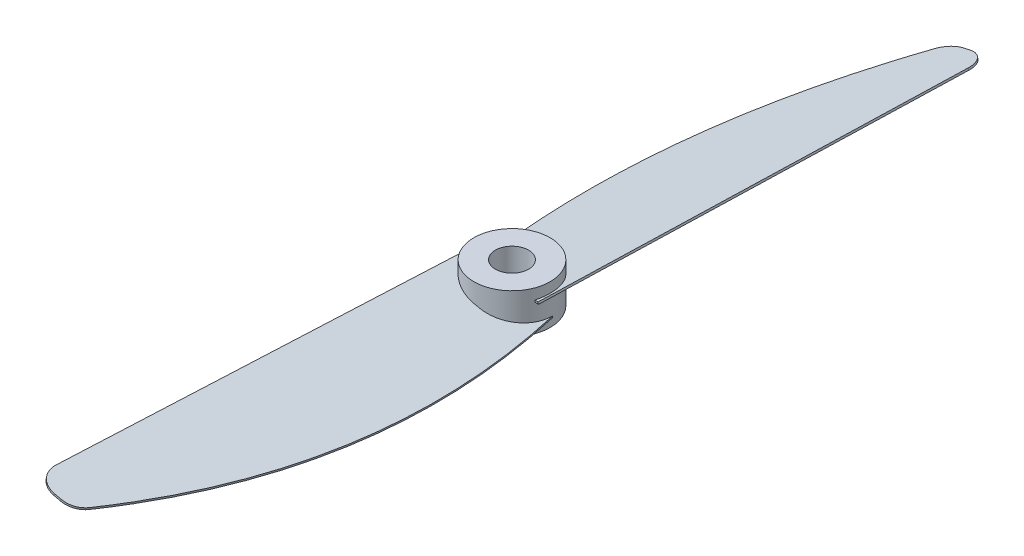
ISO-10303-21;
HEADER;
FILE_DESCRIPTION(('STEP AP214'),'2;1');
FILE_NAME('part.step','',(''),(''),'','','');
FILE_SCHEMA(('AUTOMOTIVE_DESIGN { 1 0 10303 214 1 1 1 1 }'));
ENDSEC;
DATA;
#1=APPLICATION_CONTEXT('core data for automotive mechanical design processes');
#2=APPLICATION_PROTOCOL_DEFINITION('international standard','automotive_design',2000,#1);
#3=PRODUCT_CONTEXT('',#1,'mechanical');
#4=PRODUCT('Part','Part','',(#3));
#5=PRODUCT_RELATED_PRODUCT_CATEGORY('part','',(#4));
#6=PRODUCT_DEFINITION_FORMATION('','',#4);
#7=PRODUCT_DEFINITION_CONTEXT('part definition',#1,'design');
#8=PRODUCT_DEFINITION('design','',#6,#7);
#9=PRODUCT_DEFINITION_SHAPE('','',#8);
#10=(LENGTH_UNIT() NAMED_UNIT(*) SI_UNIT(.MILLI.,.METRE.));
#11=(NAMED_UNIT(*) PLANE_ANGLE_UNIT() SI_UNIT($,.RADIAN.));
#12=(NAMED_UNIT(*) SI_UNIT($,.STERADIAN.) SOLID_ANGLE_UNIT());
#13=UNCERTAINTY_MEASURE_WITH_UNIT(LENGTH_MEASURE(1.E-05),#10,'distance_accuracy_value','');
#14=(GEOMETRIC_REPRESENTATION_CONTEXT(3) GLOBAL_UNCERTAINTY_ASSIGNED_CONTEXT((#13)) GLOBAL_UNIT_ASSIGNED_CONTEXT((#10,
#11,#12)) REPRESENTATION_CONTEXT('',''));
#15=CARTESIAN_POINT('',(0.,0.,0.));
#16=DIRECTION('',(0.,0.,1.));
#17=DIRECTION('',(1.,0.,0.));
#18=AXIS2_PLACEMENT_3D('',#15,#16,#17);
#19=CARTESIAN_POINT('',(0.,3.,0.));
#20=DIRECTION('',(0.,-1.,0.));
#21=DIRECTION('',(0.,0.,-1.));
#22=AXIS2_PLACEMENT_3D('',#19,#20,#21);
#23=CYLINDRICAL_SURFACE('',#22,5.75);
#24=CARTESIAN_POINT('',(0.,-0.15394561616901,0.));
#25=DIRECTION('',(0.224951054343865,0.974370064785235,0.));
#26=DIRECTION('',(0.974370064785235,-0.224951054343865,0.));
#27=AXIS2_PLACEMENT_3D('',#24,#25,#26);
#28=ELLIPSE('',#27,5.901248619812,5.75);
#29=CARTESIAN_POINT('',(-5.42146745832079,1.09769876917962,-1.91577415119024));
#30=VERTEX_POINT('',#29);
#31=CARTESIAN_POINT('',(0.320003598356577,-0.227824268075263,5.74108854635071));
#32=VERTEX_POINT('',#31);
#33=EDGE_CURVE('E218',#30,#32,#28,.T.);
#34=ORIENTED_EDGE('',*,*,#33,.F.);
#35=CARTESIAN_POINT('',(0.,-6.93927751788447,0.));
#36=DIRECTION('',(-0.254152524242742,0.0586757335419178,0.965382645749529));
#37=DIRECTION('',(-0.0149383231038506,-0.998277094945746,0.0567422964773818));
#38=AXIS2_PLACEMENT_3D('',#35,#36,#37);
#39=ELLIPSE('',#38,97.9962184178271,5.75);
#40=CARTESIAN_POINT('',(-5.41541737803292,1.40419323042541,-1.93281003249131));
#41=VERTEX_POINT('',#40);
#42=EDGE_CURVE('E376',#41,#30,#39,.T.);
#43=ORIENTED_EDGE('',*,*,#42,.F.);
#44=CARTESIAN_POINT('',(0.,0.153945616169008,0.));
#45=DIRECTION('',(0.224951054343865,0.974370064785235,0.));
#46=DIRECTION('',(0.974370064785235,-0.224951054343865,0.));
#47=AXIS2_PLACEMENT_3D('',#44,#45,#46);
#48=ELLIPSE('',#47,5.901248619812,5.75);
#49=CARTESIAN_POINT('',(0.35462215758342,0.0720746401146801,5.73905420129059));
#50=VERTEX_POINT('',#49);
#51=EDGE_CURVE('E367',#41,#50,#48,.T.);
#52=ORIENTED_EDGE('',*,*,#51,.T.);
#53=CARTESIAN_POINT('',(0.320003598355671,-0.227824268075054,5.7410885463507));
#54=CARTESIAN_POINT('',(0.325773371717424,-0.177840999841732,5.74076694689687));
#55=CARTESIAN_POINT('',(0.331543138333912,-0.127857790042579,5.74043661841495));
#56=CARTESIAN_POINT('',(0.343082658076362,-0.0278914873126153,5.73975850339491));
#57=CARTESIAN_POINT('',(0.348852411202323,0.0220916056181964,5.7394107168568));
#58=CARTESIAN_POINT('',(0.35462215758302,0.0720746401148378,5.73905420129059));
#59=B_SPLINE_CURVE_WITH_KNOTS('',3,(#53,#54,#55,#56,#57,#58),.UNSPECIFIED.,.F.,.F.,(4,2,4),(0.,
0.150948617979321,0.301897235958643),.UNSPECIFIED.);
#60=EDGE_CURVE('E370',#32,#50,#59,.T.);
#61=ORIENTED_EDGE('',*,*,#60,.F.);
#62=EDGE_LOOP('',(#34,#43,#52,#61));
#63=FACE_BOUND('',#62,.T.);
#64=CARTESIAN_POINT('',(0.,3.,0.));
#65=DIRECTION('',(0.,1.,0.));
#66=DIRECTION('',(0.,0.,1.));
#67=AXIS2_PLACEMENT_3D('',#64,#65,#66);
#68=CIRCLE('',#67,5.75);
#69=CARTESIAN_POINT('',(0.,3.,5.75));
#70=VERTEX_POINT('',#69);
#71=EDGE_CURVE('E222',#70,#70,#68,.T.);
#72=ORIENTED_EDGE('',*,*,#71,.F.);
#73=EDGE_LOOP('',(#72));
#74=FACE_BOUND('',#73,.T.);
#75=CARTESIAN_POINT('',(0.,-3.,0.));
#76=DIRECTION('',(0.,1.,0.));
#77=DIRECTION('',(0.,0.,1.));
#78=AXIS2_PLACEMENT_3D('',#75,#76,#77);
#79=CIRCLE('',#78,5.75);
#80=CARTESIAN_POINT('',(0.,-3.,5.75));
#81=VERTEX_POINT('',#80);
#82=EDGE_CURVE('E226',#81,#81,#79,.T.);
#83=ORIENTED_EDGE('',*,*,#82,.T.);
#84=EDGE_LOOP('',(#83));
#85=FACE_BOUND('',#84,.T.);
#86=CARTESIAN_POINT('',(0.,-0.15394561616901,0.));
#87=DIRECTION('',(-0.224951054343865,0.974370064785235,0.));
#88=DIRECTION('',(-0.974370064785235,-0.224951054343865,0.));
#89=AXIS2_PLACEMENT_3D('',#86,#87,#88);
#90=ELLIPSE('',#89,5.901248619812,5.75);
#91=CARTESIAN_POINT('',(5.42146745832079,1.09769876917962,1.91577415119024));
#92=VERTEX_POINT('',#91);
#93=CARTESIAN_POINT('',(-0.320003598356577,-0.227824268075263,-5.74108854635071));
#94=VERTEX_POINT('',#93);
#95=EDGE_CURVE('E11',#92,#94,#90,.T.);
#96=ORIENTED_EDGE('',*,*,#95,.F.);
#97=CARTESIAN_POINT('',(0.,-6.93927751788447,0.));
#98=DIRECTION('',(0.254152524242742,0.0586757335419178,-0.965382645749529));
#99=DIRECTION('',(0.0149383231038506,-0.998277094945746,-0.0567422964773818));
#100=AXIS2_PLACEMENT_3D('',#97,#98,#99);
#101=ELLIPSE('',#100,97.9962184178271,5.75);
#102=CARTESIAN_POINT('',(5.41541737803292,1.40419323042541,1.93281003249131));
#103=VERTEX_POINT('',#102);
#104=EDGE_CURVE('E40',#103,#92,#101,.T.);
#105=ORIENTED_EDGE('',*,*,#104,.F.);
#106=CARTESIAN_POINT('',(0.,0.153945616169008,0.));
#107=DIRECTION('',(-0.224951054343865,0.974370064785235,0.));
#108=DIRECTION('',(-0.974370064785235,-0.224951054343865,0.));
#109=AXIS2_PLACEMENT_3D('',#106,#107,#108);
#110=ELLIPSE('',#109,5.901248619812,5.75);
#111=CARTESIAN_POINT('',(-0.35462215758342,0.0720746401146801,-5.73905420129059));
#112=VERTEX_POINT('',#111);
#113=EDGE_CURVE('E264',#103,#112,#110,.T.);
#114=ORIENTED_EDGE('',*,*,#113,.T.);
#115=CARTESIAN_POINT('',(-0.320003598355671,-0.227824268075054,-5.7410885463507));
#116=CARTESIAN_POINT('',(-0.325773371717424,-0.177840999841732,-5.74076694689687));
#117=CARTESIAN_POINT('',(-0.331543138333912,-0.127857790042579,-5.74043661841495));
#118=CARTESIAN_POINT('',(-0.343082658076362,-0.0278914873126153,-5.73975850339491));
#119=CARTESIAN_POINT('',(-0.348852411202323,0.0220916056181964,-5.7394107168568));
#120=CARTESIAN_POINT('',(-0.35462215758302,0.0720746401148378,-5.73905420129059));
#121=B_SPLINE_CURVE_WITH_KNOTS('',3,(#115,#116,#117,#118,#119,#120),.UNSPECIFIED.,.F.,.F.,(4,2,
4),(0.,0.150948617979321,0.301897235958643),.UNSPECIFIED.);
#122=EDGE_CURVE('E231',#94,#112,#121,.T.);
#123=ORIENTED_EDGE('',*,*,#122,.F.);
#124=EDGE_LOOP('',(#96,#105,#114,#123));
#125=FACE_BOUND('',#124,.T.);
#126=ADVANCED_FACE('F32',(#63,#74,#85,#125),#23,.T.);
#127=CARTESIAN_POINT('',(0.,3.,0.));
#128=DIRECTION('',(0.,1.,0.));
#129=DIRECTION('',(0.,0.,1.));
#130=AXIS2_PLACEMENT_3D('',#127,#128,#129);
#131=PLANE('',#130);
#132=CARTESIAN_POINT('',(0.,3.,0.));
#133=DIRECTION('',(0.,-1.,0.));
#134=DIRECTION('',(0.,0.,-1.));
#135=AXIS2_PLACEMENT_3D('',#132,#133,#134);
#136=CIRCLE('',#135,2.5);
#137=CARTESIAN_POINT('',(0.,3.,-2.5));
#138=VERTEX_POINT('',#137);
#139=EDGE_CURVE('E296',#138,#138,#136,.T.);
#140=ORIENTED_EDGE('',*,*,#139,.T.);
#141=EDGE_LOOP('',(#140));
#142=FACE_BOUND('',#141,.T.);
#143=ORIENTED_EDGE('',*,*,#71,.T.);
#144=EDGE_LOOP('',(#143));
#145=FACE_BOUND('',#144,.T.);
#146=ADVANCED_FACE('F197',(#142,#145),#131,.T.);
#147=CARTESIAN_POINT('',(0.,-3.,0.));
#148=DIRECTION('',(0.,1.,0.));
#149=DIRECTION('',(0.,0.,1.));
#150=AXIS2_PLACEMENT_3D('',#147,#148,#149);
#151=PLANE('',#150);
#152=CARTESIAN_POINT('',(0.,-3.,0.));
#153=DIRECTION('',(0.,-1.,0.));
#154=DIRECTION('',(0.,0.,-1.));
#155=AXIS2_PLACEMENT_3D('',#152,#153,#154);
#156=CIRCLE('',#155,2.5);
#157=CARTESIAN_POINT('',(0.,-3.,-2.5));
#158=VERTEX_POINT('',#157);
#159=EDGE_CURVE('E298',#158,#158,#156,.T.);
#160=ORIENTED_EDGE('',*,*,#159,.F.);
#161=EDGE_LOOP('',(#160));
#162=FACE_BOUND('',#161,.T.);
#163=ORIENTED_EDGE('',*,*,#82,.F.);
#164=EDGE_LOOP('',(#163));
#165=FACE_BOUND('',#164,.T.);
#166=ADVANCED_FACE('F199',(#162,#165),#151,.F.);
#167=CARTESIAN_POINT('',(0.623814062032038,-0.297964440269035,0.));
#168=DIRECTION('',(0.224951054343865,0.974370064785235,0.));
#169=DIRECTION('',(0.,0.,1.));
#170=AXIS2_PLACEMENT_3D('',#167,#168,#169);
#171=ELLIPSE('',#170,5.75,5.6026278725151);
#172=DIRECTION('',(0.224951054343865,0.974370064785235,0.));
#173=VECTOR('',#172,1.);
#174=SURFACE_OF_LINEAR_EXTRUSION('',#171,#173);
#175=CARTESIAN_POINT('',(6.08284694514214,-1.55828148728764,0.));
#176=VERTEX_POINT('',#175);
#177=EDGE_CURVE('E326',#32,#176,#171,.T.);
#178=ORIENTED_EDGE('',*,*,#177,.F.);
#179=ORIENTED_EDGE('',*,*,#60,.T.);
#180=CARTESIAN_POINT('',(0.691299378335197,-0.00565342083346486,0.));
#181=DIRECTION('',(0.224951054343865,0.974370064785235,0.));
#182=DIRECTION('',(0.,0.,1.));
#183=AXIS2_PLACEMENT_3D('',#180,#181,#182);
#184=ELLIPSE('',#183,5.75,5.6026278725151);
#185=CARTESIAN_POINT('',(6.1503322614453,-1.26597046785207,0.));
#186=VERTEX_POINT('',#185);
#187=EDGE_CURVE('E55',#50,#186,#184,.T.);
#188=ORIENTED_EDGE('',*,*,#187,.T.);
#189=DIRECTION('',(0.224951054343865,0.974370064785235,0.));
#190=VECTOR('',#189,1.);
#191=CARTESIAN_POINT('',(6.08284694514214,-1.55828148728764,0.));
#192=LINE('',#191,#190);
#193=EDGE_CURVE('E329',#176,#186,#192,.T.);
#194=ORIENTED_EDGE('',*,*,#193,.F.);
#195=EDGE_LOOP('',(#178,#179,#188,#194));
#196=FACE_BOUND('',#195,.T.);
#197=ADVANCED_FACE('F194',(#196),#174,.F.);
#198=CARTESIAN_POINT('',(6.08284694514214,-1.55828148728764,0.));
#199=CARTESIAN_POINT('',(10.2891863918162,-2.52939146660138,21.6172098991041));
#200=CARTESIAN_POINT('',(7.59814688807845,-1.90811604412601,42.3045704262307));
#201=CARTESIAN_POINT('',(-1.9562153612587,0.297682285736829,61.8455049539977));
#202=B_SPLINE_CURVE_WITH_KNOTS('',3,(#198,#199,#200,#201),.UNSPECIFIED.,.F.,.F.,(4,4),(0.,
0.972510393663525),.UNSPECIFIED.);
#203=DIRECTION('',(0.224951054343865,0.974370064785235,0.));
#204=VECTOR('',#203,1.);
#205=SURFACE_OF_LINEAR_EXTRUSION('',#202,#204);
#206=CARTESIAN_POINT('',(6.1503322614453,-1.26597046785206,0.));
#207=CARTESIAN_POINT('',(10.3566717081194,-2.23708044716581,21.6172098991041));
#208=CARTESIAN_POINT('',(7.66563220438161,-1.61580502469044,42.3045704262307));
#209=CARTESIAN_POINT('',(-1.88873004495554,0.5899933051724,61.8455049539977));
#210=B_SPLINE_CURVE_WITH_KNOTS('',3,(#206,#207,#208,#209),.UNSPECIFIED.,.F.,.F.,(4,4),(0.,
0.972510393663525),.UNSPECIFIED.);
#211=CARTESIAN_POINT('',(-1.88873004495554,0.5899933051724,61.8455049539977));
#212=VERTEX_POINT('',#211);
#213=EDGE_CURVE('E168',#186,#212,#210,.T.);
#214=ORIENTED_EDGE('',*,*,#213,.T.);
#215=DIRECTION('',(0.224951054343865,0.974370064785235,0.));
#216=VECTOR('',#215,1.);
#217=CARTESIAN_POINT('',(-1.9562153612587,0.297682285736829,61.8455049539977));
#218=LINE('',#217,#216);
#219=CARTESIAN_POINT('',(-1.9562153612587,0.297682285736829,61.8455049539977));
#220=VERTEX_POINT('',#219);
#221=EDGE_CURVE('E363',#220,#212,#218,.T.);
#222=ORIENTED_EDGE('',*,*,#221,.F.);
#223=EDGE_CURVE('E177',#176,#220,#202,.T.);
#224=ORIENTED_EDGE('',*,*,#223,.F.);
#225=ORIENTED_EDGE('',*,*,#193,.T.);
#226=EDGE_LOOP('',(#214,#222,#224,#225));
#227=FACE_BOUND('',#226,.T.);
#228=ADVANCED_FACE('F189',(#227),#205,.F.);
#229=CARTESIAN_POINT('',(-4.56883864553936,0.900853897471233,60.5));
#230=DIRECTION('',(0.224951054343865,0.974370064785235,0.));
#231=DIRECTION('',(-0.974370064785235,0.224951054343865,0.));
#232=AXIS2_PLACEMENT_3D('',#229,#230,#231);
#233=CYLINDRICAL_SURFACE('',#232,3.);
#234=CARTESIAN_POINT('',(-4.5013533292362,1.1931649169068,60.5));
#235=DIRECTION('',(-0.224951054343865,-0.974370064785235,0.));
#236=DIRECTION('',(0.974370064785235,-0.224951054343865,0.));
#237=AXIS2_PLACEMENT_3D('',#234,#235,#236);
#238=CIRCLE('',#237,3.);
#239=CARTESIAN_POINT('',(-4.5013533292362,1.1931649169068,63.5));
#240=VERTEX_POINT('',#239);
#241=EDGE_CURVE('E171',#212,#240,#238,.T.);
#242=ORIENTED_EDGE('',*,*,#241,.T.);
#243=DIRECTION('',(0.224951054343865,0.974370064785235,0.));
#244=VECTOR('',#243,1.);
#245=CARTESIAN_POINT('',(-4.56883864553936,0.900853897471232,63.5));
#246=LINE('',#245,#244);
#247=CARTESIAN_POINT('',(-4.56883864553936,0.900853897471232,63.5));
#248=VERTEX_POINT('',#247);
#249=EDGE_CURVE('E360',#248,#240,#246,.T.);
#250=ORIENTED_EDGE('',*,*,#249,.F.);
#251=CARTESIAN_POINT('',(-4.56883864553936,0.900853897471233,60.5));
#252=DIRECTION('',(-0.224951054343865,-0.974370064785235,0.));
#253=DIRECTION('',(0.974370064785235,-0.224951054343865,0.));
#254=AXIS2_PLACEMENT_3D('',#251,#252,#253);
#255=CIRCLE('',#254,3.);
#256=EDGE_CURVE('E183',#220,#248,#255,.T.);
#257=ORIENTED_EDGE('',*,*,#256,.F.);
#258=ORIENTED_EDGE('',*,*,#221,.T.);
#259=EDGE_LOOP('',(#242,#250,#257,#258));
#260=FACE_BOUND('',#259,.T.);
#261=ADVANCED_FACE('F193',(#260),#233,.T.);
#262=CARTESIAN_POINT('',(-5.61219552855261,1.14173181375091,63.5));
#263=DIRECTION('',(0.,0.,-1.));
#264=DIRECTION('',(-1.,0.,0.));
#265=AXIS2_PLACEMENT_3D('',#262,#263,#264);
#266=PLANE('',#265);
#267=DIRECTION('',(-0.974370064785235,0.224951054343866,0.));
#268=VECTOR('',#267,1.);
#269=CARTESIAN_POINT('',(-5.54471021224945,1.43404283318648,63.5));
#270=LINE('',#269,#268);
#271=CARTESIAN_POINT('',(-5.54471021224945,1.43404283318648,63.5));
#272=VERTEX_POINT('',#271);
#273=EDGE_CURVE('E339',#240,#272,#270,.T.);
#274=ORIENTED_EDGE('',*,*,#273,.T.);
#275=DIRECTION('',(0.224951054343865,0.974370064785235,0.));
#276=VECTOR('',#275,1.);
#277=CARTESIAN_POINT('',(-5.61219552855261,1.14173181375091,63.5));
#278=LINE('',#277,#276);
#279=CARTESIAN_POINT('',(-5.61219552855261,1.14173181375091,63.5));
#280=VERTEX_POINT('',#279);
#281=EDGE_CURVE('E357',#280,#272,#278,.T.);
#282=ORIENTED_EDGE('',*,*,#281,.F.);
#283=DIRECTION('',(-0.974370064785235,0.224951054343866,0.));
#284=VECTOR('',#283,1.);
#285=CARTESIAN_POINT('',(-5.61219552855261,1.14173181375091,63.5));
#286=LINE('',#285,#284);
#287=EDGE_CURVE('E401',#248,#280,#286,.T.);
#288=ORIENTED_EDGE('',*,*,#287,.F.);
#289=ORIENTED_EDGE('',*,*,#249,.T.);
#290=EDGE_LOOP('',(#274,#282,#288,#289));
#291=FACE_BOUND('',#290,.T.);
#292=ADVANCED_FACE('F400',(#291),#266,.F.);
#293=CARTESIAN_POINT('',(-5.61219552855263,1.14173181375091,60.5));
#294=DIRECTION('',(0.224951054343865,0.974370064785235,0.));
#295=DIRECTION('',(-0.974370064785235,0.224951054343865,0.));
#296=AXIS2_PLACEMENT_3D('',#293,#294,#295);
#297=CYLINDRICAL_SURFACE('',#296,3.);
#298=CARTESIAN_POINT('',(-5.54471021224947,1.43404283318648,60.5));
#299=DIRECTION('',(-0.224951054343865,-0.974370064785235,0.));
#300=DIRECTION('',(-0.974370064785235,0.224951054343865,0.));
#301=AXIS2_PLACEMENT_3D('',#298,#299,#300);
#302=CIRCLE('',#301,3.);
#303=CARTESIAN_POINT('',(-8.46547182310008,2.10835378299255,60.3797654144891));
#304=VERTEX_POINT('',#303);
#305=EDGE_CURVE('E341',#272,#304,#302,.T.);
#306=ORIENTED_EDGE('',*,*,#305,.T.);
#307=DIRECTION('',(0.224951054343865,0.974370064785235,0.));
#308=VECTOR('',#307,1.);
#309=CARTESIAN_POINT('',(-8.53295713940324,1.81604276355698,60.3797654144891));
#310=LINE('',#309,#308);
#311=CARTESIAN_POINT('',(-8.53295713940324,1.81604276355698,60.3797654144891));
#312=VERTEX_POINT('',#311);
#313=EDGE_CURVE('E354',#312,#304,#310,.T.);
#314=ORIENTED_EDGE('',*,*,#313,.F.);
#315=CARTESIAN_POINT('',(-5.61219552855263,1.14173181375091,60.5));
#316=DIRECTION('',(-0.224951054343865,-0.974370064785235,0.));
#317=DIRECTION('',(-0.974370064785235,0.224951054343865,0.));
#318=AXIS2_PLACEMENT_3D('',#315,#316,#317);
#319=CIRCLE('',#318,3.);
#320=EDGE_CURVE('E397',#280,#312,#319,.T.);
#321=ORIENTED_EDGE('',*,*,#320,.F.);
#322=ORIENTED_EDGE('',*,*,#281,.T.);
#323=EDGE_LOOP('',(#306,#314,#321,#322));
#324=FACE_BOUND('',#323,.T.);
#325=ADVANCED_FACE('F394',(#324),#297,.T.);
#326=CARTESIAN_POINT('',(-6.09104178824922,1.25228218355431,-2.10144591786276));
#327=DIRECTION('',(0.973587203616871,-0.224770316602023,0.0400781951702895));
#328=DIRECTION('',(0.224951054343865,0.974370064785235,0.));
#329=AXIS2_PLACEMENT_3D('',#326,#327,#328);
#330=PLANE('',#329);
#331=DIRECTION('',(0.0390509936245502,-0.00901563225975583,-0.999196546367076));
#332=VECTOR('',#331,1.);
#333=CARTESIAN_POINT('',(-6.02355647194606,1.54459320298988,-2.10144591786276));
#334=LINE('',#333,#332);
#335=CARTESIAN_POINT('',(-6.02355647194606,1.54459320298988,-2.10144591786276));
#336=VERTEX_POINT('',#335);
#337=EDGE_CURVE('E343',#304,#336,#334,.T.);
#338=ORIENTED_EDGE('',*,*,#337,.T.);
#339=DIRECTION('',(0.224951054343865,0.974370064785235,0.));
#340=VECTOR('',#339,1.);
#341=CARTESIAN_POINT('',(-6.09104178824922,1.25228218355431,-2.10144591786276));
#342=LINE('',#341,#340);
#343=CARTESIAN_POINT('',(-6.09104178824922,1.25228218355431,-2.10144591786276));
#344=VERTEX_POINT('',#343);
#345=EDGE_CURVE('E351',#344,#336,#342,.T.);
#346=ORIENTED_EDGE('',*,*,#345,.F.);
#347=DIRECTION('',(0.0390509936245502,-0.00901563225975583,-0.999196546367076));
#348=VECTOR('',#347,1.);
#349=CARTESIAN_POINT('',(-6.09104178824922,1.25228218355431,-2.10144591786276));
#350=LINE('',#349,#348);
#351=EDGE_CURVE('E389',#312,#344,#350,.T.);
#352=ORIENTED_EDGE('',*,*,#351,.F.);
#353=ORIENTED_EDGE('',*,*,#313,.T.);
#354=EDGE_LOOP('',(#338,#346,#352,#353));
#355=FACE_BOUND('',#354,.T.);
#356=ADVANCED_FACE('F388',(#355),#330,.F.);
#357=CARTESIAN_POINT('',(-4.59509043008419,0.906914599482916,-1.68662127612905));
#358=DIRECTION('',(-0.254152524242742,0.0586757335419178,0.965382645749529));
#359=DIRECTION('',(0.967048778978541,0.,0.254591160640177));
#360=AXIS2_PLACEMENT_3D('',#357,#358,#359);
#361=PLANE('',#360);
#362=DIRECTION('',(0.94063995108151,-0.217163844006627,0.260837779636386));
#363=VECTOR('',#362,1.);
#364=CARTESIAN_POINT('',(-4.52760511378103,1.19922561891849,-1.68662127612905));
#365=LINE('',#364,#363);
#366=EDGE_CURVE('E345',#336,#41,#365,.T.);
#367=ORIENTED_EDGE('',*,*,#366,.T.);
#368=ORIENTED_EDGE('',*,*,#42,.T.);
#369=DIRECTION('',(0.94063995108151,-0.217163844006627,0.260837779636386));
#370=VECTOR('',#369,1.);
#371=CARTESIAN_POINT('',(-4.59509043008419,0.906914599482916,-1.68662127612905));
#372=LINE('',#371,#370);
#373=EDGE_CURVE('E330',#344,#30,#372,.T.);
#374=ORIENTED_EDGE('',*,*,#373,.F.);
#375=ORIENTED_EDGE('',*,*,#345,.T.);
#376=EDGE_LOOP('',(#367,#368,#374,#375));
#377=FACE_BOUND('',#376,.T.);
#378=ADVANCED_FACE('F318',(#377),#361,.F.);
#379=CARTESIAN_POINT('',(7.22357892794593,-1.82164021671662,31.7013557412503));
#380=DIRECTION('',(0.224951054343865,0.974370064785235,0.));
#381=DIRECTION('',(-0.974370064785235,0.224951054343865,0.));
#382=AXIS2_PLACEMENT_3D('',#379,#380,#381);
#383=PLANE('',#382);
#384=ORIENTED_EDGE('',*,*,#373,.T.);
#385=ORIENTED_EDGE('',*,*,#33,.T.);
#386=ORIENTED_EDGE('',*,*,#177,.T.);
#387=ORIENTED_EDGE('',*,*,#223,.T.);
#388=ORIENTED_EDGE('',*,*,#256,.T.);
#389=ORIENTED_EDGE('',*,*,#287,.T.);
#390=ORIENTED_EDGE('',*,*,#320,.T.);
#391=ORIENTED_EDGE('',*,*,#351,.T.);
#392=EDGE_LOOP('',(#384,#385,#386,#387,#388,#389,#390,#391));
#393=FACE_BOUND('',#392,.T.);
#394=ADVANCED_FACE('F315',(#393),#383,.F.);
#395=CARTESIAN_POINT('',(7.29106424424909,-1.52932919728105,31.7013557412503));
#396=DIRECTION('',(0.224951054343865,0.974370064785235,0.));
#397=DIRECTION('',(-0.974370064785235,0.224951054343865,0.));
#398=AXIS2_PLACEMENT_3D('',#395,#396,#397);
#399=PLANE('',#398);
#400=ORIENTED_EDGE('',*,*,#51,.F.);
#401=ORIENTED_EDGE('',*,*,#366,.F.);
#402=ORIENTED_EDGE('',*,*,#337,.F.);
#403=ORIENTED_EDGE('',*,*,#305,.F.);
#404=ORIENTED_EDGE('',*,*,#273,.F.);
#405=ORIENTED_EDGE('',*,*,#241,.F.);
#406=ORIENTED_EDGE('',*,*,#213,.F.);
#407=ORIENTED_EDGE('',*,*,#187,.F.);
#408=EDGE_LOOP('',(#400,#401,#402,#403,#404,#405,#406,#407));
#409=FACE_BOUND('',#408,.T.);
#410=ADVANCED_FACE('F253',(#409),#399,.T.);
#411=CARTESIAN_POINT('',(-0.623814062032038,-0.297964440269035,0.));
#412=DIRECTION('',(-0.224951054343865,0.974370064785235,0.));
#413=DIRECTION('',(0.,0.,-1.));
#414=AXIS2_PLACEMENT_3D('',#411,#412,#413);
#415=ELLIPSE('',#414,5.75,5.6026278725151);
#416=DIRECTION('',(-0.224951054343865,0.974370064785235,0.));
#417=VECTOR('',#416,1.);
#418=SURFACE_OF_LINEAR_EXTRUSION('',#415,#417);
#419=CARTESIAN_POINT('',(-6.08284694514214,-1.55828148728764,0.));
#420=VERTEX_POINT('',#419);
#421=EDGE_CURVE('E161',#94,#420,#415,.T.);
#422=ORIENTED_EDGE('',*,*,#421,.F.);
#423=ORIENTED_EDGE('',*,*,#122,.T.);
#424=CARTESIAN_POINT('',(-0.691299378335197,-0.00565342083346486,0.));
#425=DIRECTION('',(-0.224951054343865,0.974370064785235,0.));
#426=DIRECTION('',(0.,0.,-1.));
#427=AXIS2_PLACEMENT_3D('',#424,#425,#426);
#428=ELLIPSE('',#427,5.75,5.6026278725151);
#429=CARTESIAN_POINT('',(-6.1503322614453,-1.26597046785207,0.));
#430=VERTEX_POINT('',#429);
#431=EDGE_CURVE('E47',#112,#430,#428,.T.);
#432=ORIENTED_EDGE('',*,*,#431,.T.);
#433=DIRECTION('',(-0.224951054343865,0.974370064785235,0.));
#434=VECTOR('',#433,1.);
#435=CARTESIAN_POINT('',(-6.08284694514214,-1.55828148728764,0.));
#436=LINE('',#435,#434);
#437=EDGE_CURVE('E236',#420,#430,#436,.T.);
#438=ORIENTED_EDGE('',*,*,#437,.F.);
#439=EDGE_LOOP('',(#422,#423,#432,#438));
#440=FACE_BOUND('',#439,.T.);
#441=ADVANCED_FACE('F235',(#440),#418,.F.);
#442=CARTESIAN_POINT('',(-6.08284694514214,-1.55828148728764,0.));
#443=CARTESIAN_POINT('',(-10.2891863918162,-2.52939146660138,-21.6172098991041));
#444=CARTESIAN_POINT('',(-7.59814688807845,-1.90811604412601,-42.3045704262307));
#445=CARTESIAN_POINT('',(1.9562153612587,0.297682285736829,-61.8455049539977));
#446=B_SPLINE_CURVE_WITH_KNOTS('',3,(#442,#443,#444,#445),.UNSPECIFIED.,.F.,.F.,(4,4),(0.,
0.972510393663525),.UNSPECIFIED.);
#447=DIRECTION('',(-0.224951054343865,0.974370064785235,0.));
#448=VECTOR('',#447,1.);
#449=SURFACE_OF_LINEAR_EXTRUSION('',#446,#448);
#450=CARTESIAN_POINT('',(-6.1503322614453,-1.26597046785206,0.));
#451=CARTESIAN_POINT('',(-10.3566717081194,-2.23708044716581,-21.6172098991041));
#452=CARTESIAN_POINT('',(-7.66563220438161,-1.61580502469044,-42.3045704262307));
#453=CARTESIAN_POINT('',(1.88873004495554,0.5899933051724,-61.8455049539977));
#454=B_SPLINE_CURVE_WITH_KNOTS('',3,(#450,#451,#452,#453),.UNSPECIFIED.,.F.,.F.,(4,4),(0.,
0.972510393663525),.UNSPECIFIED.);
#455=CARTESIAN_POINT('',(1.88873004495554,0.5899933051724,-61.8455049539977));
#456=VERTEX_POINT('',#455);
#457=EDGE_CURVE('E167',#430,#456,#454,.T.);
#458=ORIENTED_EDGE('',*,*,#457,.T.);
#459=DIRECTION('',(-0.224951054343865,0.974370064785235,0.));
#460=VECTOR('',#459,1.);
#461=CARTESIAN_POINT('',(1.9562153612587,0.297682285736829,-61.8455049539977));
#462=LINE('',#461,#460);
#463=CARTESIAN_POINT('',(1.9562153612587,0.297682285736829,-61.8455049539977));
#464=VERTEX_POINT('',#463);
#465=EDGE_CURVE('E148',#464,#456,#462,.T.);
#466=ORIENTED_EDGE('',*,*,#465,.F.);
#467=EDGE_CURVE('E155',#420,#464,#446,.T.);
#468=ORIENTED_EDGE('',*,*,#467,.F.);
#469=ORIENTED_EDGE('',*,*,#437,.T.);
#470=EDGE_LOOP('',(#458,#466,#468,#469));
#471=FACE_BOUND('',#470,.T.);
#472=ADVANCED_FACE('F166',(#471),#449,.F.);
#473=CARTESIAN_POINT('',(4.56883864553936,0.900853897471233,-60.5));
#474=DIRECTION('',(-0.224951054343865,0.974370064785235,0.));
#475=DIRECTION('',(-0.974370064785235,-0.224951054343865,0.));
#476=AXIS2_PLACEMENT_3D('',#473,#474,#475);
#477=CYLINDRICAL_SURFACE('',#476,3.);
#478=CARTESIAN_POINT('',(4.5013533292362,1.1931649169068,-60.5));
#479=DIRECTION('',(0.224951054343865,-0.974370064785235,0.));
#480=DIRECTION('',(-0.974370064785235,-0.224951054343865,0.));
#481=AXIS2_PLACEMENT_3D('',#478,#479,#480);
#482=CIRCLE('',#481,3.);
#483=CARTESIAN_POINT('',(4.5013533292362,1.1931649169068,-63.5));
#484=VERTEX_POINT('',#483);
#485=EDGE_CURVE('E294',#456,#484,#482,.T.);
#486=ORIENTED_EDGE('',*,*,#485,.T.);
#487=DIRECTION('',(-0.224951054343865,0.974370064785235,0.));
#488=VECTOR('',#487,1.);
#489=CARTESIAN_POINT('',(4.56883864553936,0.900853897471232,-63.5));
#490=LINE('',#489,#488);
#491=CARTESIAN_POINT('',(4.56883864553936,0.900853897471232,-63.5));
#492=VERTEX_POINT('',#491);
#493=EDGE_CURVE('E151',#492,#484,#490,.T.);
#494=ORIENTED_EDGE('',*,*,#493,.F.);
#495=CARTESIAN_POINT('',(4.56883864553936,0.900853897471233,-60.5));
#496=DIRECTION('',(0.224951054343865,-0.974370064785235,0.));
#497=DIRECTION('',(-0.974370064785235,-0.224951054343865,0.));
#498=AXIS2_PLACEMENT_3D('',#495,#496,#497);
#499=CIRCLE('',#498,3.);
#500=EDGE_CURVE('E144',#464,#492,#499,.T.);
#501=ORIENTED_EDGE('',*,*,#500,.F.);
#502=ORIENTED_EDGE('',*,*,#465,.T.);
#503=EDGE_LOOP('',(#486,#494,#501,#502));
#504=FACE_BOUND('',#503,.T.);
#505=ADVANCED_FACE('F146',(#504),#477,.T.);
#506=CARTESIAN_POINT('',(5.61219552855261,1.14173181375091,-63.5));
#507=DIRECTION('',(0.,0.,1.));
#508=DIRECTION('',(1.,0.,0.));
#509=AXIS2_PLACEMENT_3D('',#506,#507,#508);
#510=PLANE('',#509);
#511=DIRECTION('',(0.974370064785235,0.224951054343866,0.));
#512=VECTOR('',#511,1.);
#513=CARTESIAN_POINT('',(5.54471021224945,1.43404283318648,-63.5));
#514=LINE('',#513,#512);
#515=CARTESIAN_POINT('',(5.54471021224945,1.43404283318648,-63.5));
#516=VERTEX_POINT('',#515);
#517=EDGE_CURVE('E293',#484,#516,#514,.T.);
#518=ORIENTED_EDGE('',*,*,#517,.T.);
#519=DIRECTION('',(-0.224951054343865,0.974370064785235,0.));
#520=VECTOR('',#519,1.);
#521=CARTESIAN_POINT('',(5.61219552855261,1.14173181375091,-63.5));
#522=LINE('',#521,#520);
#523=CARTESIAN_POINT('',(5.61219552855261,1.14173181375091,-63.5));
#524=VERTEX_POINT('',#523);
#525=EDGE_CURVE('E173',#524,#516,#522,.T.);
#526=ORIENTED_EDGE('',*,*,#525,.F.);
#527=DIRECTION('',(0.974370064785235,0.224951054343866,0.));
#528=VECTOR('',#527,1.);
#529=CARTESIAN_POINT('',(5.61219552855261,1.14173181375091,-63.5));
#530=LINE('',#529,#528);
#531=EDGE_CURVE('E154',#492,#524,#530,.T.);
#532=ORIENTED_EDGE('',*,*,#531,.F.);
#533=ORIENTED_EDGE('',*,*,#493,.T.);
#534=EDGE_LOOP('',(#518,#526,#532,#533));
#535=FACE_BOUND('',#534,.T.);
#536=ADVANCED_FACE('F442',(#535),#510,.F.);
#537=CARTESIAN_POINT('',(5.61219552855263,1.14173181375091,-60.5));
#538=DIRECTION('',(-0.224951054343865,0.974370064785235,0.));
#539=DIRECTION('',(-0.974370064785235,-0.224951054343865,0.));
#540=AXIS2_PLACEMENT_3D('',#537,#538,#539);
#541=CYLINDRICAL_SURFACE('',#540,3.);
#542=CARTESIAN_POINT('',(5.54471021224947,1.43404283318648,-60.5));
#543=DIRECTION('',(0.224951054343865,-0.974370064785235,0.));
#544=DIRECTION('',(0.974370064785235,0.224951054343865,0.));
#545=AXIS2_PLACEMENT_3D('',#542,#543,#544);
#546=CIRCLE('',#545,3.);
#547=CARTESIAN_POINT('',(8.46547182310008,2.10835378299255,-60.3797654144891));
#548=VERTEX_POINT('',#547);
#549=EDGE_CURVE('E276',#516,#548,#546,.T.);
#550=ORIENTED_EDGE('',*,*,#549,.T.);
#551=DIRECTION('',(-0.224951054343865,0.974370064785235,0.));
#552=VECTOR('',#551,1.);
#553=CARTESIAN_POINT('',(8.53295713940324,1.81604276355698,-60.3797654144891));
#554=LINE('',#553,#552);
#555=CARTESIAN_POINT('',(8.53295713940324,1.81604276355698,-60.3797654144891));
#556=VERTEX_POINT('',#555);
#557=EDGE_CURVE('E281',#556,#548,#554,.T.);
#558=ORIENTED_EDGE('',*,*,#557,.F.);
#559=CARTESIAN_POINT('',(5.61219552855263,1.14173181375091,-60.5));
#560=DIRECTION('',(0.224951054343865,-0.974370064785235,0.));
#561=DIRECTION('',(0.974370064785235,0.224951054343865,0.));
#562=AXIS2_PLACEMENT_3D('',#559,#560,#561);
#563=CIRCLE('',#562,3.);
#564=EDGE_CURVE('E290',#524,#556,#563,.T.);
#565=ORIENTED_EDGE('',*,*,#564,.F.);
#566=ORIENTED_EDGE('',*,*,#525,.T.);
#567=EDGE_LOOP('',(#550,#558,#565,#566));
#568=FACE_BOUND('',#567,.T.);
#569=ADVANCED_FACE('F288',(#568),#541,.T.);
#570=CARTESIAN_POINT('',(6.09104178824922,1.25228218355431,2.10144591786276));
#571=DIRECTION('',(-0.973587203616871,-0.224770316602023,-0.0400781951702895));
#572=DIRECTION('',(0.224951054343865,-0.974370064785235,0.));
#573=AXIS2_PLACEMENT_3D('',#570,#571,#572);
#574=PLANE('',#573);
#575=DIRECTION('',(-0.0390509936245502,-0.00901563225975583,0.999196546367076));
#576=VECTOR('',#575,1.);
#577=CARTESIAN_POINT('',(6.02355647194606,1.54459320298988,2.10144591786276));
#578=LINE('',#577,#576);
#579=CARTESIAN_POINT('',(6.02355647194606,1.54459320298988,2.10144591786276));
#580=VERTEX_POINT('',#579);
#581=EDGE_CURVE('E273',#548,#580,#578,.T.);
#582=ORIENTED_EDGE('',*,*,#581,.T.);
#583=DIRECTION('',(-0.224951054343865,0.974370064785235,0.));
#584=VECTOR('',#583,1.);
#585=CARTESIAN_POINT('',(6.09104178824922,1.25228218355431,2.10144591786276));
#586=LINE('',#585,#584);
#587=CARTESIAN_POINT('',(6.09104178824922,1.25228218355431,2.10144591786276));
#588=VERTEX_POINT('',#587);
#589=EDGE_CURVE('E238',#588,#580,#586,.T.);
#590=ORIENTED_EDGE('',*,*,#589,.F.);
#591=DIRECTION('',(-0.0390509936245502,-0.00901563225975583,0.999196546367076));
#592=VECTOR('',#591,1.);
#593=CARTESIAN_POINT('',(6.09104178824922,1.25228218355431,2.10144591786276));
#594=LINE('',#593,#592);
#595=EDGE_CURVE('E240',#556,#588,#594,.T.);
#596=ORIENTED_EDGE('',*,*,#595,.F.);
#597=ORIENTED_EDGE('',*,*,#557,.T.);
#598=EDGE_LOOP('',(#582,#590,#596,#597));
#599=FACE_BOUND('',#598,.T.);
#600=ADVANCED_FACE('F453',(#599),#574,.F.);
#601=CARTESIAN_POINT('',(4.59509043008419,0.906914599482916,1.68662127612905));
#602=DIRECTION('',(0.254152524242742,0.0586757335419178,-0.965382645749529));
#603=DIRECTION('',(-0.967048778978541,0.,-0.254591160640177));
#604=AXIS2_PLACEMENT_3D('',#601,#602,#603);
#605=PLANE('',#604);
#606=DIRECTION('',(-0.94063995108151,-0.217163844006627,-0.260837779636386));
#607=VECTOR('',#606,1.);
#608=CARTESIAN_POINT('',(4.52760511378103,1.19922561891849,1.68662127612905));
#609=LINE('',#608,#607);
#610=EDGE_CURVE('E270',#580,#103,#609,.T.);
#611=ORIENTED_EDGE('',*,*,#610,.T.);
#612=ORIENTED_EDGE('',*,*,#104,.T.);
#613=DIRECTION('',(-0.94063995108151,-0.217163844006627,-0.260837779636386));
#614=VECTOR('',#613,1.);
#615=CARTESIAN_POINT('',(4.59509043008419,0.906914599482916,1.68662127612905));
#616=LINE('',#615,#614);
#617=EDGE_CURVE('E233',#588,#92,#616,.T.);
#618=ORIENTED_EDGE('',*,*,#617,.F.);
#619=ORIENTED_EDGE('',*,*,#589,.T.);
#620=EDGE_LOOP('',(#611,#612,#618,#619));
#621=FACE_BOUND('',#620,.T.);
#622=ADVANCED_FACE('F256',(#621),#605,.F.);
#623=CARTESIAN_POINT('',(-7.22357892794593,-1.82164021671662,-31.7013557412503));
#624=DIRECTION('',(-0.224951054343865,0.974370064785235,0.));
#625=DIRECTION('',(0.974370064785235,0.224951054343865,0.));
#626=AXIS2_PLACEMENT_3D('',#623,#624,#625);
#627=PLANE('',#626);
#628=ORIENTED_EDGE('',*,*,#617,.T.);
#629=ORIENTED_EDGE('',*,*,#95,.T.);
#630=ORIENTED_EDGE('',*,*,#421,.T.);
#631=ORIENTED_EDGE('',*,*,#467,.T.);
#632=ORIENTED_EDGE('',*,*,#500,.T.);
#633=ORIENTED_EDGE('',*,*,#531,.T.);
#634=ORIENTED_EDGE('',*,*,#564,.T.);
#635=ORIENTED_EDGE('',*,*,#595,.T.);
#636=EDGE_LOOP('',(#628,#629,#630,#631,#632,#633,#634,#635));
#637=FACE_BOUND('',#636,.T.);
#638=ADVANCED_FACE('F159',(#637),#627,.F.);
#639=CARTESIAN_POINT('',(-7.29106424424909,-1.52932919728105,-31.7013557412503));
#640=DIRECTION('',(-0.224951054343865,0.974370064785235,0.));
#641=DIRECTION('',(0.974370064785235,0.224951054343865,0.));
#642=AXIS2_PLACEMENT_3D('',#639,#640,#641);
#643=PLANE('',#642);
#644=ORIENTED_EDGE('',*,*,#113,.F.);
#645=ORIENTED_EDGE('',*,*,#610,.F.);
#646=ORIENTED_EDGE('',*,*,#581,.F.);
#647=ORIENTED_EDGE('',*,*,#549,.F.);
#648=ORIENTED_EDGE('',*,*,#517,.F.);
#649=ORIENTED_EDGE('',*,*,#485,.F.);
#650=ORIENTED_EDGE('',*,*,#457,.F.);
#651=ORIENTED_EDGE('',*,*,#431,.F.);
#652=EDGE_LOOP('',(#644,#645,#646,#647,#648,#649,#650,#651));
#653=FACE_BOUND('',#652,.T.);
#654=ADVANCED_FACE('F254',(#653),#643,.T.);
#655=CARTESIAN_POINT('',(0.,3.,0.));
#656=DIRECTION('',(0.,-1.,0.));
#657=DIRECTION('',(0.,0.,-1.));
#658=AXIS2_PLACEMENT_3D('',#655,#656,#657);
#659=CYLINDRICAL_SURFACE('',#658,2.5);
#660=ORIENTED_EDGE('',*,*,#139,.F.);
#661=EDGE_LOOP('',(#660));
#662=FACE_BOUND('',#661,.T.);
#663=ORIENTED_EDGE('',*,*,#159,.T.);
#664=EDGE_LOOP('',(#663));
#665=FACE_BOUND('',#664,.T.);
#666=ADVANCED_FACE('F476',(#662,#665),#659,.F.);
#667=CLOSED_SHELL('',(#126,#146,#166,#197,#228,#261,#292,#325,#356,#378,#394,#410,#441,#472,
#505,#536,#569,#600,#622,#638,#654,#666));
#668=MANIFOLD_SOLID_BREP('B2',#667);
#669=ADVANCED_BREP_SHAPE_REPRESENTATION('',(#18,#668),#14);
#670=SHAPE_DEFINITION_REPRESENTATION(#9,#669);
ENDSEC;
END-ISO-10303-21;
